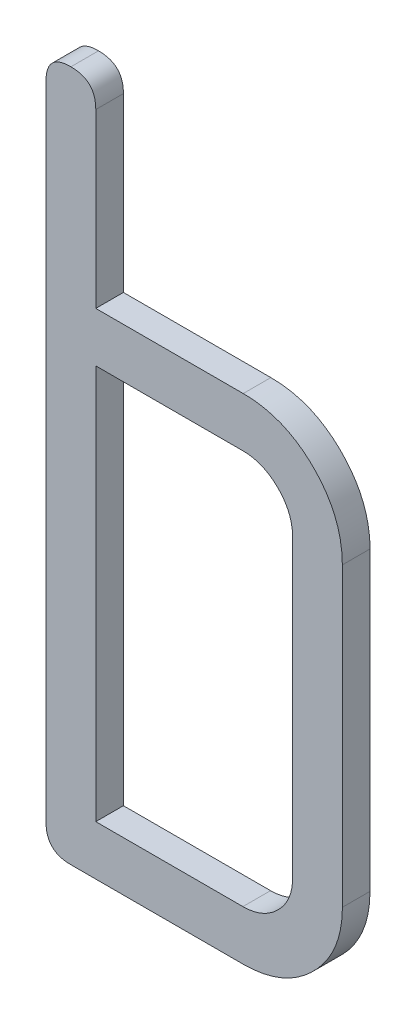
ISO-10303-21;
HEADER;
FILE_DESCRIPTION(('STEP AP214'),'2;1');
FILE_NAME('part.step','',(''),(''),'','','');
FILE_SCHEMA(('AUTOMOTIVE_DESIGN { 1 0 10303 214 1 1 1 1 }'));
ENDSEC;
DATA;
#1=APPLICATION_CONTEXT('core data for automotive mechanical design processes');
#2=APPLICATION_PROTOCOL_DEFINITION('international standard','automotive_design',2000,#1);
#3=PRODUCT_CONTEXT('',#1,'mechanical');
#4=PRODUCT('Part','Part','',(#3));
#5=PRODUCT_RELATED_PRODUCT_CATEGORY('part','',(#4));
#6=PRODUCT_DEFINITION_FORMATION('','',#4);
#7=PRODUCT_DEFINITION_CONTEXT('part definition',#1,'design');
#8=PRODUCT_DEFINITION('design','',#6,#7);
#9=PRODUCT_DEFINITION_SHAPE('','',#8);
#10=(LENGTH_UNIT() NAMED_UNIT(*) SI_UNIT(.MILLI.,.METRE.));
#11=(NAMED_UNIT(*) PLANE_ANGLE_UNIT() SI_UNIT($,.RADIAN.));
#12=(NAMED_UNIT(*) SI_UNIT($,.STERADIAN.) SOLID_ANGLE_UNIT());
#13=UNCERTAINTY_MEASURE_WITH_UNIT(LENGTH_MEASURE(1.E-05),#10,'distance_accuracy_value','');
#14=(GEOMETRIC_REPRESENTATION_CONTEXT(3) GLOBAL_UNCERTAINTY_ASSIGNED_CONTEXT((#13)) GLOBAL_UNIT_ASSIGNED_CONTEXT((#10,
#11,#12)) REPRESENTATION_CONTEXT('',''));
#15=CARTESIAN_POINT('',(0.,0.,0.));
#16=DIRECTION('',(0.,0.,1.));
#17=DIRECTION('',(1.,0.,0.));
#18=AXIS2_PLACEMENT_3D('',#15,#16,#17);
#19=CARTESIAN_POINT('',(0.,0.,1.7));
#20=DIRECTION('',(0.,0.,-1.));
#21=DIRECTION('',(-1.,0.,0.));
#22=AXIS2_PLACEMENT_3D('',#19,#20,#21);
#23=PLANE('',#22);
#24=CARTESIAN_POINT('',(-12.7169437525272,-19.5733047798276,1.7));
#25=CARTESIAN_POINT('',(-12.6269437525272,-19.5733047798276,1.7));
#26=CARTESIAN_POINT('',(-12.6269437525272,-19.6623047798276,1.7));
#27=B_SPLINE_CURVE_WITH_KNOTS('',2,(#24,#25,#26),.UNSPECIFIED.,.F.,.F.,(3,3),(0.,1.),.UNSPECIFIED.);
#28=CARTESIAN_POINT('',(-12.7169437525272,-19.5733047798276,1.7));
#29=VERTEX_POINT('',#28);
#30=CARTESIAN_POINT('',(-12.6269437525272,-19.6623047798276,1.7));
#31=VERTEX_POINT('',#30);
#32=EDGE_CURVE('E128',#29,#31,#27,.T.);
#33=ORIENTED_EDGE('',*,*,#32,.F.);
#34=CARTESIAN_POINT('',(-12.8069437525272,-19.6626172798276,1.7));
#35=CARTESIAN_POINT('',(-12.8069437525272,-19.5733047798276,1.7));
#36=CARTESIAN_POINT('',(-12.7169437525272,-19.5733047798276,1.7));
#37=B_SPLINE_CURVE_WITH_KNOTS('',2,(#34,#35,#36),.UNSPECIFIED.,.F.,.F.,(3,3),(0.,1.),.UNSPECIFIED.);
#38=CARTESIAN_POINT('',(-12.8069437525272,-19.6626172798276,1.7));
#39=VERTEX_POINT('',#38);
#40=EDGE_CURVE('E122',#39,#29,#37,.T.);
#41=ORIENTED_EDGE('',*,*,#40,.F.);
#42=DIRECTION('',(0.,1.,0.));
#43=VECTOR('',#42,1.);
#44=CARTESIAN_POINT('',(-12.8069437525272,-21.9839922798276,1.7));
#45=LINE('',#44,#43);
#46=CARTESIAN_POINT('',(-12.8069437525272,-21.9839922798276,1.7));
#47=VERTEX_POINT('',#46);
#48=EDGE_CURVE('E125',#47,#39,#45,.T.);
#49=ORIENTED_EDGE('',*,*,#48,.F.);
#50=CARTESIAN_POINT('',(-12.7176312525272,-22.0733047798276,1.7));
#51=CARTESIAN_POINT('',(-12.8069437525272,-22.0733047798276,1.7));
#52=CARTESIAN_POINT('',(-12.8069437525272,-21.9839922798276,1.7));
#53=B_SPLINE_CURVE_WITH_KNOTS('',2,(#50,#51,#52),.UNSPECIFIED.,.F.,.F.,(3,3),(0.,1.),.UNSPECIFIED.);
#54=CARTESIAN_POINT('',(-12.7176312525272,-22.0733047798276,1.7));
#55=VERTEX_POINT('',#54);
#56=EDGE_CURVE('E149',#47,#55,#53,.F.);
#57=ORIENTED_EDGE('',*,*,#56,.T.);
#58=DIRECTION('',(1.,0.,0.));
#59=VECTOR('',#58,1.);
#60=CARTESIAN_POINT('',(-12.0940687525272,-22.0733047798276,1.7));
#61=LINE('',#60,#59);
#62=CARTESIAN_POINT('',(-12.0940687525272,-22.0733047798276,1.7));
#63=VERTEX_POINT('',#62);
#64=EDGE_CURVE('E153',#63,#55,#61,.F.);
#65=ORIENTED_EDGE('',*,*,#64,.F.);
#66=CARTESIAN_POINT('',(-12.0940687525272,-22.0733047798276,1.7));
#67=CARTESIAN_POINT('',(-12.0835914524858,-22.0733048365618,1.7));
#68=CARTESIAN_POINT('',(-12.073114725821,-22.0729124755181,1.7));
#69=CARTESIAN_POINT('',(-12.0522178373082,-22.0712779212898,1.7));
#70=CARTESIAN_POINT('',(-12.041797745024,-22.0700348511606,1.7));
#71=CARTESIAN_POINT('',(-12.0109126991727,-22.0649616449102,1.7));
#72=CARTESIAN_POINT('',(-11.9906440888762,-22.0597895657084,1.7));
#73=CARTESIAN_POINT('',(-11.9517095701505,-22.0458335747576,1.7));
#74=CARTESIAN_POINT('',(-11.9330256046604,-22.0370997733915,1.7));
#75=CARTESIAN_POINT('',(-11.897503706816,-22.0163935749344,1.7));
#76=CARTESIAN_POINT('',(-11.8806696717177,-22.004414518186,1.7));
#77=CARTESIAN_POINT('',(-11.8574686643992,-21.9849217049437,1.7));
#78=CARTESIAN_POINT('',(-11.8502566677725,-21.9783769739309,1.7));
#79=CARTESIAN_POINT('',(-11.8363033916105,-21.9648034297382,1.7));
#80=CARTESIAN_POINT('',(-11.8295620996491,-21.9577746293467,1.7));
#81=CARTESIAN_POINT('',(-11.810171637487,-21.9359742575068,1.7));
#82=CARTESIAN_POINT('',(-11.7983270245127,-21.9204646790887,1.7));
#83=CARTESIAN_POINT('',(-11.7762557120634,-21.8857792862421,1.7));
#84=CARTESIAN_POINT('',(-11.7663643529929,-21.8663871826324,1.7));
#85=CARTESIAN_POINT('',(-11.7506169685404,-21.8260158209381,1.7));
#86=CARTESIAN_POINT('',(-11.7447620664972,-21.80503612283,1.7));
#87=CARTESIAN_POINT('',(-11.7388510091757,-21.7724925152227,1.7));
#88=CARTESIAN_POINT('',(-11.737362110455,-21.7611626763634,1.7));
#89=CARTESIAN_POINT('',(-11.7354097183411,-21.7384480020841,1.7));
#90=CARTESIAN_POINT('',(-11.734943152836,-21.7270634347479,1.7));
#91=CARTESIAN_POINT('',(-11.7349437525272,-21.7156797798276,1.7));
#92=B_SPLINE_CURVE_WITH_KNOTS('',3,(#66,#67,#68,#69,#70,#71,#72,#73,#74,#75,#76,#77,#78,#79,#80,
#81,#82,#83,#84,#85,#86,#87,#88,#89,#90,#91),.UNSPECIFIED.,.F.,.F.,(4,2,2,2,2,2,2,2,2,2,2,2,4),
(0.,0.0314203551476073,0.0628731485243589,0.125248921244741,0.186775837705111,0.248429984002855,
0.27762787915987,0.306825003242671,0.365107642748379,0.429993472428567,0.494897352435936,
0.529139249772235,0.563278108260437),.UNSPECIFIED.);
#93=CARTESIAN_POINT('',(-11.7349437525272,-21.7156797798276,1.7));
#94=VERTEX_POINT('',#93);
#95=EDGE_CURVE('E156',#63,#94,#92,.T.);
#96=ORIENTED_EDGE('',*,*,#95,.T.);
#97=DIRECTION('',(0.,1.,0.));
#98=VECTOR('',#97,1.);
#99=CARTESIAN_POINT('',(-11.7349437525272,-20.6429297798276,1.7));
#100=LINE('',#99,#98);
#101=CARTESIAN_POINT('',(-11.7349437525272,-20.6429297798276,1.7));
#102=VERTEX_POINT('',#101);
#103=EDGE_CURVE('E160',#102,#94,#100,.F.);
#104=ORIENTED_EDGE('',*,*,#103,.F.);
#105=CARTESIAN_POINT('',(-11.7349437525272,-20.6429297798276,1.7));
#106=CARTESIAN_POINT('',(-11.7349438065931,-20.6324532068069,1.7));
#107=CARTESIAN_POINT('',(-11.7353345334151,-20.6219771509781,1.7));
#108=CARTESIAN_POINT('',(-11.7369643163058,-20.6010807141977,1.7));
#109=CARTESIAN_POINT('',(-11.738204296593,-20.5906604063786,1.7));
#110=CARTESIAN_POINT('',(-11.7432702341652,-20.5597667812642,1.7));
#111=CARTESIAN_POINT('',(-11.7484401536519,-20.5394893369763,1.7));
#112=CARTESIAN_POINT('',(-11.7624097653175,-20.5005601205354,1.7));
#113=CARTESIAN_POINT('',(-11.7711563430554,-20.4818892059032,1.7));
#114=CARTESIAN_POINT('',(-11.7919127182465,-20.4464184302079,1.7));
#115=CARTESIAN_POINT('',(-11.8039286766642,-20.4296221869926,1.7));
#116=CARTESIAN_POINT('',(-11.8234369140789,-20.4065616622283,1.7));
#117=CARTESIAN_POINT('',(-11.8299486303523,-20.399436012233,1.7));
#118=CARTESIAN_POINT('',(-11.8434526627909,-20.3856555261654,1.7));
#119=CARTESIAN_POINT('',(-11.850444958151,-20.3790006697368,1.7));
#120=CARTESIAN_POINT('',(-11.8721294707985,-20.359870303108,1.7));
#121=CARTESIAN_POINT('',(-11.8875537523424,-20.3481998490659,1.7));
#122=CARTESIAN_POINT('',(-11.921963691998,-20.326497095518,1.7));
#123=CARTESIAN_POINT('',(-11.9411544696895,-20.3167862547127,1.7));
#124=CARTESIAN_POINT('',(-11.9810712697399,-20.3012721795261,1.7));
#125=CARTESIAN_POINT('',(-12.0017981994609,-20.2954712753851,1.7));
#126=CARTESIAN_POINT('',(-12.0345117796089,-20.2894220641814,1.7));
#127=CARTESIAN_POINT('',(-12.0462770650628,-20.2878513237265,1.7));
#128=CARTESIAN_POINT('',(-12.0698646056397,-20.2857940070144,1.7));
#129=CARTESIAN_POINT('',(-12.0816865465059,-20.2853038850315,1.7));
#130=CARTESIAN_POINT('',(-12.0935062525272,-20.2853047798276,1.7));
#131=B_SPLINE_CURVE_WITH_KNOTS('',3,(#105,#106,#107,#108,#109,#110,#111,#112,#113,#114,#115,
#116,#117,#118,#119,#120,#121,#122,#123,#124,#125,#126,#127,#128,#129,#130),.UNSPECIFIED.,.F.,
.F.,(4,2,2,2,2,2,2,2,2,2,2,2,4),(0.,0.0314182812754547,0.0628708086224728,0.125268135688372,
0.186770678789938,0.248389932432918,0.277329759725516,0.306268334950325,0.364032467799609,
0.428151331100405,0.492308374192021,0.527873693296446,0.563322140703057),.UNSPECIFIED.);
#132=CARTESIAN_POINT('',(-12.0935062525272,-20.2853047798276,1.7));
#133=VERTEX_POINT('',#132);
#134=EDGE_CURVE('E163',#102,#133,#131,.T.);
#135=ORIENTED_EDGE('',*,*,#134,.T.);
#136=DIRECTION('',(1.,0.,0.));
#137=VECTOR('',#136,1.);
#138=CARTESIAN_POINT('',(-12.6269437525272,-20.2853047798276,1.7));
#139=LINE('',#138,#137);
#140=CARTESIAN_POINT('',(-12.6269437525272,-20.2853047798276,1.7));
#141=VERTEX_POINT('',#140);
#142=EDGE_CURVE('E167',#141,#133,#139,.T.);
#143=ORIENTED_EDGE('',*,*,#142,.F.);
#144=DIRECTION('',(0.,1.,0.));
#145=VECTOR('',#144,1.);
#146=CARTESIAN_POINT('',(-12.6269437525272,-19.6623047798276,1.7));
#147=LINE('',#146,#145);
#148=EDGE_CURVE('E168',#31,#141,#147,.F.);
#149=ORIENTED_EDGE('',*,*,#148,.F.);
#150=EDGE_LOOP('',(#33,#41,#49,#57,#65,#96,#104,#135,#143,#149));
#151=FACE_BOUND('',#150,.T.);
#152=CARTESIAN_POINT('',(-11.9149437525272,-20.6438047798276,1.7));
#153=CARTESIAN_POINT('',(-11.914930147431,-20.6353604891261,1.7));
#154=CARTESIAN_POINT('',(-11.9154762004344,-20.6269015094391,1.7));
#155=CARTESIAN_POINT('',(-11.9177585864412,-20.6101706620539,1.7));
#156=CARTESIAN_POINT('',(-11.9194918047125,-20.601898363092,1.7));
#157=CARTESIAN_POINT('',(-11.9246736552446,-20.5841530247187,1.7));
#158=CARTESIAN_POINT('',(-11.9283882984683,-20.5747554216561,1.7));
#159=CARTESIAN_POINT('',(-11.9374705722218,-20.5567941650655,1.7));
#160=CARTESIAN_POINT('',(-11.9428397536227,-20.5482313039322,1.7));
#161=CARTESIAN_POINT('',(-11.9545088094744,-20.5326565741331,1.7));
#162=CARTESIAN_POINT('',(-11.9607235418156,-20.5255795559619,1.7));
#163=CARTESIAN_POINT('',(-11.9740178972537,-20.5122859772569,1.7));
#164=CARTESIAN_POINT('',(-11.9810981101327,-20.506070009709,1.7));
#165=CARTESIAN_POINT('',(-11.9976635468281,-20.4935829889184,1.7));
#166=CARTESIAN_POINT('',(-12.0073439176488,-20.4875635304049,1.7));
#167=CARTESIAN_POINT('',(-12.0277174481314,-20.4776127878627,1.7));
#168=CARTESIAN_POINT('',(-12.0384088579455,-20.4736779710752,1.7));
#169=CARTESIAN_POINT('',(-12.0567602216907,-20.4689613757244,1.7));
#170=CARTESIAN_POINT('',(-12.0642715951245,-20.4675697946959,1.7));
#171=CARTESIAN_POINT('',(-12.0794220785268,-20.4657374321208,1.7));
#172=CARTESIAN_POINT('',(-12.0870613572021,-20.4652980256877,1.7));
#173=CARTESIAN_POINT('',(-12.0946937525272,-20.4653047798276,1.7));
#174=B_SPLINE_CURVE_WITH_KNOTS('',3,(#152,#153,#154,#155,#156,#157,#158,#159,#160,#161,#162,
#163,#164,#165,#166,#167,#168,#169,#170,#171,#172,#173),.UNSPECIFIED.,.F.,.F.,(4,2,2,2,2,2,2,2,
2,2,4),(0.,0.0253350805156604,0.050603943433854,0.0807375528376654,0.110899494153716,
0.139064712853079,0.167249232879575,0.201230326274568,0.235153647566171,0.258012845749728,
0.280905034838524),.UNSPECIFIED.);
#175=CARTESIAN_POINT('',(-11.9149437525272,-20.6438047798276,1.7));
#176=VERTEX_POINT('',#175);
#177=CARTESIAN_POINT('',(-12.0946937525272,-20.4653047798276,1.7));
#178=VERTEX_POINT('',#177);
#179=EDGE_CURVE('E174',#176,#178,#174,.T.);
#180=ORIENTED_EDGE('',*,*,#179,.F.);
#181=DIRECTION('',(0.,1.,0.));
#182=VECTOR('',#181,1.);
#183=CARTESIAN_POINT('',(-11.9149437525272,-21.7148047798276,1.7));
#184=LINE('',#183,#182);
#185=CARTESIAN_POINT('',(-11.9149437525272,-21.7148047798276,1.7));
#186=VERTEX_POINT('',#185);
#187=EDGE_CURVE('E180',#176,#186,#184,.F.);
#188=ORIENTED_EDGE('',*,*,#187,.T.);
#189=CARTESIAN_POINT('',(-12.0946937525272,-21.8933047798276,1.7));
#190=CARTESIAN_POINT('',(-12.0862492512627,-21.8933181233194,1.7));
#191=CARTESIAN_POINT('',(-12.0777917968435,-21.892776187793,1.7));
#192=CARTESIAN_POINT('',(-12.0610635679903,-21.8905184445288,1.7));
#193=CARTESIAN_POINT('',(-12.0527923024834,-21.8888062254049,1.7));
#194=CARTESIAN_POINT('',(-12.034906085994,-21.8836594387585,1.7));
#195=CARTESIAN_POINT('',(-12.0253706950559,-21.8799401247856,1.7));
#196=CARTESIAN_POINT('',(-12.007123682082,-21.8708350658922,1.7));
#197=CARTESIAN_POINT('',(-11.9984133313438,-21.8654468021443,1.7));
#198=CARTESIAN_POINT('',(-11.9824651705536,-21.8536830163784,1.7));
#199=CARTESIAN_POINT('',(-11.9751716985514,-21.847381365031,1.7));
#200=CARTESIAN_POINT('',(-11.9614827286623,-21.8338707520946,1.7));
#201=CARTESIAN_POINT('',(-11.955086880106,-21.8266621469189,1.7));
#202=CARTESIAN_POINT('',(-11.9435957712379,-21.811444401755,1.7));
#203=CARTESIAN_POINT('',(-11.9384808969445,-21.8034503337011,1.7));
#204=CARTESIAN_POINT('',(-11.9296927241598,-21.7867102604086,1.7));
#205=CARTESIAN_POINT('',(-11.9260177792691,-21.7779651279657,1.7));
#206=CARTESIAN_POINT('',(-11.9203371131119,-21.7602614776157,1.7));
#207=CARTESIAN_POINT('',(-11.9182822167484,-21.7513184871417,1.7));
#208=CARTESIAN_POINT('',(-11.9155714960484,-21.7331787926239,1.7));
#209=CARTESIAN_POINT('',(-11.9149220037474,-21.7239811286246,1.7));
#210=CARTESIAN_POINT('',(-11.9149437525272,-21.7148047798276,1.7));
#211=B_SPLINE_CURVE_WITH_KNOTS('',3,(#189,#190,#191,#192,#193,#194,#195,#196,#197,#198,#199,
#200,#201,#202,#203,#204,#205,#206,#207,#208,#209,#210),.UNSPECIFIED.,.F.,.F.,(4,2,2,2,2,2,2,2,
2,2,4),(0.,0.0253332488046499,0.0505891609902319,0.0811127050569341,0.111682542474013,
0.140508172396911,0.169322509646491,0.197664171259586,0.225973332100662,0.253386006580878,
0.280921933664846),.UNSPECIFIED.);
#212=CARTESIAN_POINT('',(-12.0946937525272,-21.8933047798276,1.7));
#213=VERTEX_POINT('',#212);
#214=EDGE_CURVE('E23',#213,#186,#211,.T.);
#215=ORIENTED_EDGE('',*,*,#214,.F.);
#216=DIRECTION('',(1.,0.,0.));
#217=VECTOR('',#216,1.);
#218=CARTESIAN_POINT('',(-12.6269437525272,-21.8933047798276,1.7));
#219=LINE('',#218,#217);
#220=CARTESIAN_POINT('',(-12.6269437525272,-21.8933047798276,1.7));
#221=VERTEX_POINT('',#220);
#222=EDGE_CURVE('E187',#213,#221,#219,.F.);
#223=ORIENTED_EDGE('',*,*,#222,.T.);
#224=DIRECTION('',(0.,1.,0.));
#225=VECTOR('',#224,1.);
#226=CARTESIAN_POINT('',(-12.6269437525272,-20.4653047798276,1.7));
#227=LINE('',#226,#225);
#228=CARTESIAN_POINT('',(-12.6269437525272,-20.4653047798276,1.7));
#229=VERTEX_POINT('',#228);
#230=EDGE_CURVE('E200',#221,#229,#227,.T.);
#231=ORIENTED_EDGE('',*,*,#230,.T.);
#232=DIRECTION('',(1.,0.,0.));
#233=VECTOR('',#232,1.);
#234=CARTESIAN_POINT('',(-12.0946937525272,-20.4653047798276,1.7));
#235=LINE('',#234,#233);
#236=EDGE_CURVE('E497',#229,#178,#235,.T.);
#237=ORIENTED_EDGE('',*,*,#236,.T.);
#238=EDGE_LOOP('',(#180,#188,#215,#223,#231,#237));
#239=FACE_BOUND('',#238,.T.);
#240=ADVANCED_FACE('F17',(#151,#239),#23,.F.);
#241=CARTESIAN_POINT('',(-12.0946937525272,-20.4653047798276,1.7));
#242=DIRECTION('',(0.,1.,0.));
#243=DIRECTION('',(0.,0.,1.));
#244=AXIS2_PLACEMENT_3D('',#241,#242,#243);
#245=PLANE('',#244);
#246=DIRECTION('',(0.,0.,-1.));
#247=VECTOR('',#246,1.);
#248=CARTESIAN_POINT('',(-12.0946937525272,-20.4653047798276,1.65));
#249=LINE('',#248,#247);
#250=CARTESIAN_POINT('',(-12.0946937525272,-20.4653047798276,1.6));
#251=VERTEX_POINT('',#250);
#252=EDGE_CURVE('E171',#178,#251,#249,.T.);
#253=ORIENTED_EDGE('',*,*,#252,.F.);
#254=ORIENTED_EDGE('',*,*,#236,.F.);
#255=DIRECTION('',(0.,0.,1.));
#256=VECTOR('',#255,1.);
#257=CARTESIAN_POINT('',(-12.6269437525272,-20.4653047798276,1.7));
#258=LINE('',#257,#256);
#259=CARTESIAN_POINT('',(-12.6269437525272,-20.4653047798276,1.6));
#260=VERTEX_POINT('',#259);
#261=EDGE_CURVE('E197',#229,#260,#258,.F.);
#262=ORIENTED_EDGE('',*,*,#261,.T.);
#263=DIRECTION('',(-1.,0.,0.));
#264=VECTOR('',#263,1.);
#265=CARTESIAN_POINT('',(0.,-20.4653047798276,1.6));
#266=LINE('',#265,#264);
#267=EDGE_CURVE('E194',#251,#260,#266,.T.);
#268=ORIENTED_EDGE('',*,*,#267,.F.);
#269=EDGE_LOOP('',(#253,#254,#262,#268));
#270=FACE_BOUND('',#269,.T.);
#271=ADVANCED_FACE('F218',(#270),#245,.F.);
#272=CARTESIAN_POINT('',(-12.6269437525272,-20.4653047798276,1.7));
#273=DIRECTION('',(-1.,0.,0.));
#274=DIRECTION('',(0.,0.,1.));
#275=AXIS2_PLACEMENT_3D('',#272,#273,#274);
#276=PLANE('',#275);
#277=ORIENTED_EDGE('',*,*,#261,.F.);
#278=ORIENTED_EDGE('',*,*,#230,.F.);
#279=DIRECTION('',(0.,0.,-1.));
#280=VECTOR('',#279,1.);
#281=CARTESIAN_POINT('',(-12.6269437525272,-21.8933047798276,1.7));
#282=LINE('',#281,#280);
#283=CARTESIAN_POINT('',(-12.6269437525272,-21.8933047798276,1.6));
#284=VERTEX_POINT('',#283);
#285=EDGE_CURVE('E184',#221,#284,#282,.T.);
#286=ORIENTED_EDGE('',*,*,#285,.T.);
#287=DIRECTION('',(0.,1.,0.));
#288=VECTOR('',#287,1.);
#289=CARTESIAN_POINT('',(-12.6269437525272,0.,1.6));
#290=LINE('',#289,#288);
#291=EDGE_CURVE('E190',#260,#284,#290,.F.);
#292=ORIENTED_EDGE('',*,*,#291,.F.);
#293=EDGE_LOOP('',(#277,#278,#286,#292));
#294=FACE_BOUND('',#293,.T.);
#295=ADVANCED_FACE('F423',(#294),#276,.F.);
#296=CARTESIAN_POINT('',(-12.6269437525272,-21.8933047798276,1.7));
#297=DIRECTION('',(0.,-1.,0.));
#298=DIRECTION('',(0.,0.,-1.));
#299=AXIS2_PLACEMENT_3D('',#296,#297,#298);
#300=PLANE('',#299);
#301=ORIENTED_EDGE('',*,*,#285,.F.);
#302=ORIENTED_EDGE('',*,*,#222,.F.);
#303=DIRECTION('',(0.,0.,1.));
#304=VECTOR('',#303,1.);
#305=CARTESIAN_POINT('',(-12.0946937525272,-21.8933047798276,1.65));
#306=LINE('',#305,#304);
#307=CARTESIAN_POINT('',(-12.0946937525272,-21.8933047798276,1.6));
#308=VERTEX_POINT('',#307);
#309=EDGE_CURVE('E181',#308,#213,#306,.T.);
#310=ORIENTED_EDGE('',*,*,#309,.F.);
#311=DIRECTION('',(-1.,0.,0.));
#312=VECTOR('',#311,1.);
#313=CARTESIAN_POINT('',(0.,-21.8933047798276,1.6));
#314=LINE('',#313,#312);
#315=EDGE_CURVE('E193',#284,#308,#314,.F.);
#316=ORIENTED_EDGE('',*,*,#315,.F.);
#317=EDGE_LOOP('',(#301,#302,#310,#316));
#318=FACE_BOUND('',#317,.T.);
#319=ADVANCED_FACE('F416',(#318),#300,.F.);
#320=CARTESIAN_POINT('',(-11.9149437525272,-21.7148047798276,1.7));
#321=CARTESIAN_POINT('',(-11.9149437525272,-21.7879922798276,1.7));
#322=CARTESIAN_POINT('',(-12.0217562525272,-21.8933047798276,1.7));
#323=CARTESIAN_POINT('',(-12.0946937525272,-21.8933047798276,1.7));
#324=CARTESIAN_POINT('',(-11.9149437525272,-21.7148047798276,1.6));
#325=CARTESIAN_POINT('',(-11.9149437525272,-21.7879922798276,1.6));
#326=CARTESIAN_POINT('',(-12.0217562525272,-21.8933047798276,1.6));
#327=CARTESIAN_POINT('',(-12.0946937525272,-21.8933047798276,1.6));
#328=B_SPLINE_SURFACE_WITH_KNOTS('',1,2,((#320,#321,#322,#323),(#324,#325,#326,#327)),
.UNSPECIFIED.,.F.,.F.,.F.,(2,2),(3,1,3),(0.,1.),(0.,0.5,1.),.UNSPECIFIED.);
#329=DIRECTION('',(0.,0.,-1.));
#330=VECTOR('',#329,1.);
#331=CARTESIAN_POINT('',(-11.9149437525272,-21.7148047798276,1.7));
#332=LINE('',#331,#330);
#333=CARTESIAN_POINT('',(-11.9149437525272,-21.7148047798276,1.6));
#334=VERTEX_POINT('',#333);
#335=EDGE_CURVE('E178',#186,#334,#332,.T.);
#336=CARTESIAN_POINT('',(-12.0946937525272,-21.8933047798276,1.6));
#337=CARTESIAN_POINT('',(-12.0862492512627,-21.8933181233194,1.6));
#338=CARTESIAN_POINT('',(-12.0777917968435,-21.892776187793,1.6));
#339=CARTESIAN_POINT('',(-12.0610635679903,-21.8905184445288,1.6));
#340=CARTESIAN_POINT('',(-12.0527923024834,-21.8888062254049,1.6));
#341=CARTESIAN_POINT('',(-12.034906085994,-21.8836594387585,1.6));
#342=CARTESIAN_POINT('',(-12.0253706950559,-21.8799401247856,1.6));
#343=CARTESIAN_POINT('',(-12.007123682082,-21.8708350658922,1.6));
#344=CARTESIAN_POINT('',(-11.9984133313438,-21.8654468021443,1.6));
#345=CARTESIAN_POINT('',(-11.9824651705536,-21.8536830163784,1.6));
#346=CARTESIAN_POINT('',(-11.9751716985514,-21.847381365031,1.6));
#347=CARTESIAN_POINT('',(-11.9614827286623,-21.8338707520946,1.6));
#348=CARTESIAN_POINT('',(-11.955086880106,-21.8266621469189,1.6));
#349=CARTESIAN_POINT('',(-11.9435957712379,-21.811444401755,1.6));
#350=CARTESIAN_POINT('',(-11.9384808969445,-21.8034503337011,1.6));
#351=CARTESIAN_POINT('',(-11.9296927241598,-21.7867102604086,1.6));
#352=CARTESIAN_POINT('',(-11.9260177792691,-21.7779651279657,1.6));
#353=CARTESIAN_POINT('',(-11.9203371131119,-21.7602614776157,1.6));
#354=CARTESIAN_POINT('',(-11.9182822167484,-21.7513184871417,1.6));
#355=CARTESIAN_POINT('',(-11.9155714960484,-21.7331787926239,1.6));
#356=CARTESIAN_POINT('',(-11.9149220037474,-21.7239811286246,1.6));
#357=CARTESIAN_POINT('',(-11.9149437525272,-21.7148047798276,1.6));
#358=B_SPLINE_CURVE_WITH_KNOTS('',3,(#336,#337,#338,#339,#340,#341,#342,#343,#344,#345,#346,
#347,#348,#349,#350,#351,#352,#353,#354,#355,#356,#357),.UNSPECIFIED.,.F.,.F.,(4,2,2,2,2,2,2,2,
2,2,4),(0.,0.0253332488046496,0.0505891609902324,0.081112705056933,0.111682542474014,
0.140508172396913,0.169322509646496,0.197664171259602,0.225973332100676,0.253386006580885,
0.280921933664846),.UNSPECIFIED.);
#359=EDGE_CURVE('E281',#308,#334,#358,.T.);
#360=ORIENTED_EDGE('',*,*,#214,.T.);
#361=ORIENTED_EDGE('',*,*,#335,.T.);
#362=ORIENTED_EDGE('',*,*,#359,.F.);
#363=ORIENTED_EDGE('',*,*,#309,.T.);
#364=EDGE_LOOP('',(#360,#361,#362,#363));
#365=FACE_BOUND('',#364,.T.);
#366=ADVANCED_FACE('F220',(#365),#328,.T.);
#367=CARTESIAN_POINT('',(-11.9149437525272,-21.7148047798276,1.7));
#368=DIRECTION('',(1.,0.,0.));
#369=DIRECTION('',(0.,0.,-1.));
#370=AXIS2_PLACEMENT_3D('',#367,#368,#369);
#371=PLANE('',#370);
#372=ORIENTED_EDGE('',*,*,#335,.F.);
#373=ORIENTED_EDGE('',*,*,#187,.F.);
#374=DIRECTION('',(0.,0.,1.));
#375=VECTOR('',#374,1.);
#376=CARTESIAN_POINT('',(-11.9149437525272,-20.6438047798276,1.65));
#377=LINE('',#376,#375);
#378=CARTESIAN_POINT('',(-11.9149437525272,-20.6438047798276,1.6));
#379=VERTEX_POINT('',#378);
#380=EDGE_CURVE('E175',#379,#176,#377,.T.);
#381=ORIENTED_EDGE('',*,*,#380,.F.);
#382=DIRECTION('',(0.,1.,0.));
#383=VECTOR('',#382,1.);
#384=CARTESIAN_POINT('',(-11.9149437525272,0.,1.6));
#385=LINE('',#384,#383);
#386=EDGE_CURVE('E275',#334,#379,#385,.T.);
#387=ORIENTED_EDGE('',*,*,#386,.F.);
#388=EDGE_LOOP('',(#372,#373,#381,#387));
#389=FACE_BOUND('',#388,.T.);
#390=ADVANCED_FACE('F254',(#389),#371,.F.);
#391=CARTESIAN_POINT('',(-12.0946937525272,-20.4653047798276,1.7));
#392=CARTESIAN_POINT('',(-12.0217562525272,-20.4653047798276,1.7));
#393=CARTESIAN_POINT('',(-11.9149437525272,-20.5706172798276,1.7));
#394=CARTESIAN_POINT('',(-11.9149437525272,-20.6438047798276,1.7));
#395=CARTESIAN_POINT('',(-12.0946937525272,-20.4653047798276,1.6));
#396=CARTESIAN_POINT('',(-12.0217562525272,-20.4653047798276,1.6));
#397=CARTESIAN_POINT('',(-11.9149437525272,-20.5706172798276,1.6));
#398=CARTESIAN_POINT('',(-11.9149437525272,-20.6438047798276,1.6));
#399=B_SPLINE_SURFACE_WITH_KNOTS('',1,2,((#391,#392,#393,#394),(#395,#396,#397,#398)),
.UNSPECIFIED.,.F.,.F.,.F.,(2,2),(3,1,3),(0.,1.),(0.,0.5,1.),.UNSPECIFIED.);
#400=CARTESIAN_POINT('',(-11.9149437525272,-20.6438047798276,1.6));
#401=CARTESIAN_POINT('',(-11.914930147431,-20.6353604891261,1.6));
#402=CARTESIAN_POINT('',(-11.9154762004344,-20.6269015094391,1.6));
#403=CARTESIAN_POINT('',(-11.9177585864412,-20.6101706620539,1.6));
#404=CARTESIAN_POINT('',(-11.9194918047125,-20.601898363092,1.6));
#405=CARTESIAN_POINT('',(-11.9246736552446,-20.5841530247187,1.6));
#406=CARTESIAN_POINT('',(-11.9283882984683,-20.5747554216561,1.6));
#407=CARTESIAN_POINT('',(-11.9374705722218,-20.5567941650655,1.6));
#408=CARTESIAN_POINT('',(-11.9428397536227,-20.5482313039322,1.6));
#409=CARTESIAN_POINT('',(-11.9545088094744,-20.5326565741331,1.6));
#410=CARTESIAN_POINT('',(-11.9607235418156,-20.525579555962,1.6));
#411=CARTESIAN_POINT('',(-11.9740178972537,-20.5122859772569,1.6));
#412=CARTESIAN_POINT('',(-11.9810981101326,-20.506070009709,1.6));
#413=CARTESIAN_POINT('',(-11.9976635468281,-20.4935829889184,1.6));
#414=CARTESIAN_POINT('',(-12.0073439176488,-20.4875635304049,1.6));
#415=CARTESIAN_POINT('',(-12.0277174481314,-20.4776127878627,1.6));
#416=CARTESIAN_POINT('',(-12.0384088579455,-20.4736779710752,1.6));
#417=CARTESIAN_POINT('',(-12.0567602216907,-20.4689613757244,1.6));
#418=CARTESIAN_POINT('',(-12.0642715951245,-20.4675697946959,1.6));
#419=CARTESIAN_POINT('',(-12.0794220785268,-20.4657374321208,1.6));
#420=CARTESIAN_POINT('',(-12.0870613572021,-20.4652980256877,1.6));
#421=CARTESIAN_POINT('',(-12.0946937525272,-20.4653047798276,1.6));
#422=B_SPLINE_CURVE_WITH_KNOTS('',3,(#400,#401,#402,#403,#404,#405,#406,#407,#408,#409,#410,
#411,#412,#413,#414,#415,#416,#417,#418,#419,#420,#421),.UNSPECIFIED.,.F.,.F.,(4,2,2,2,2,2,2,2,
2,2,4),(0.,0.0253350805156602,0.0506039434338545,0.0807375528376653,0.110899494153708,
0.139064712853072,0.16724923287957,0.201230326274575,0.235153647566188,0.258012845749736,
0.280905034838525),.UNSPECIFIED.);
#423=EDGE_CURVE('E267',#379,#251,#422,.T.);
#424=ORIENTED_EDGE('',*,*,#179,.T.);
#425=ORIENTED_EDGE('',*,*,#252,.T.);
#426=ORIENTED_EDGE('',*,*,#423,.F.);
#427=ORIENTED_EDGE('',*,*,#380,.T.);
#428=EDGE_LOOP('',(#424,#425,#426,#427));
#429=FACE_BOUND('',#428,.T.);
#430=ADVANCED_FACE('F248',(#429),#399,.T.);
#431=CARTESIAN_POINT('',(-12.6269437525272,-19.6623047798276,1.7));
#432=DIRECTION('',(1.,0.,0.));
#433=DIRECTION('',(0.,0.,-1.));
#434=AXIS2_PLACEMENT_3D('',#431,#432,#433);
#435=PLANE('',#434);
#436=ORIENTED_EDGE('',*,*,#148,.T.);
#437=DIRECTION('',(0.,0.,1.));
#438=VECTOR('',#437,1.);
#439=CARTESIAN_POINT('',(-12.6269437525272,-20.2853047798276,1.7));
#440=LINE('',#439,#438);
#441=CARTESIAN_POINT('',(-12.6269437525272,-20.2853047798276,1.6));
#442=VERTEX_POINT('',#441);
#443=EDGE_CURVE('E164',#442,#141,#440,.T.);
#444=ORIENTED_EDGE('',*,*,#443,.F.);
#445=DIRECTION('',(0.,1.,0.));
#446=VECTOR('',#445,1.);
#447=CARTESIAN_POINT('',(-12.6269437525272,0.,1.6));
#448=LINE('',#447,#446);
#449=CARTESIAN_POINT('',(-12.6269437525272,-19.6623047798276,1.6));
#450=VERTEX_POINT('',#449);
#451=EDGE_CURVE('E274',#450,#442,#448,.F.);
#452=ORIENTED_EDGE('',*,*,#451,.F.);
#453=DIRECTION('',(0.,0.,1.));
#454=VECTOR('',#453,1.);
#455=CARTESIAN_POINT('',(-12.6269437525272,-19.6623047798276,1.65));
#456=LINE('',#455,#454);
#457=EDGE_CURVE('E140',#450,#31,#456,.T.);
#458=ORIENTED_EDGE('',*,*,#457,.T.);
#459=EDGE_LOOP('',(#436,#444,#452,#458));
#460=FACE_BOUND('',#459,.T.);
#461=ADVANCED_FACE('F253',(#460),#435,.T.);
#462=CARTESIAN_POINT('',(-12.6269437525272,-20.2853047798276,1.7));
#463=DIRECTION('',(0.,1.,0.));
#464=DIRECTION('',(0.,0.,1.));
#465=AXIS2_PLACEMENT_3D('',#462,#463,#464);
#466=PLANE('',#465);
#467=ORIENTED_EDGE('',*,*,#142,.T.);
#468=DIRECTION('',(0.,0.,-1.));
#469=VECTOR('',#468,1.);
#470=CARTESIAN_POINT('',(-12.0935062525272,-20.2853047798276,1.65));
#471=LINE('',#470,#469);
#472=CARTESIAN_POINT('',(-12.0935062525272,-20.2853047798276,1.6));
#473=VERTEX_POINT('',#472);
#474=EDGE_CURVE('E161',#133,#473,#471,.T.);
#475=ORIENTED_EDGE('',*,*,#474,.T.);
#476=DIRECTION('',(-1.,0.,0.));
#477=VECTOR('',#476,1.);
#478=CARTESIAN_POINT('',(0.,-20.2853047798276,1.6));
#479=LINE('',#478,#477);
#480=EDGE_CURVE('E542',#442,#473,#479,.F.);
#481=ORIENTED_EDGE('',*,*,#480,.F.);
#482=ORIENTED_EDGE('',*,*,#443,.T.);
#483=EDGE_LOOP('',(#467,#475,#481,#482));
#484=FACE_BOUND('',#483,.T.);
#485=ADVANCED_FACE('F384',(#484),#466,.T.);
#486=CARTESIAN_POINT('',(-12.0935062525272,-20.2853047798276,1.7));
#487=CARTESIAN_POINT('',(-11.9436937525272,-20.2853047798276,1.7));
#488=CARTESIAN_POINT('',(-11.7349437525272,-20.4944922798276,1.7));
#489=CARTESIAN_POINT('',(-11.7349437525272,-20.6429297798276,1.7));
#490=CARTESIAN_POINT('',(-12.0935062525272,-20.2853047798276,1.6));
#491=CARTESIAN_POINT('',(-11.9436937525272,-20.2853047798276,1.6));
#492=CARTESIAN_POINT('',(-11.7349437525272,-20.4944922798276,1.6));
#493=CARTESIAN_POINT('',(-11.7349437525272,-20.6429297798276,1.6));
#494=B_SPLINE_SURFACE_WITH_KNOTS('',1,2,((#486,#487,#488,#489),(#490,#491,#492,#493)),
.UNSPECIFIED.,.F.,.F.,.F.,(2,2),(3,1,3),(0.,1.),(0.,0.5,1.),.UNSPECIFIED.);
#495=DIRECTION('',(0.,0.,-1.));
#496=VECTOR('',#495,1.);
#497=CARTESIAN_POINT('',(-11.7349437525272,-20.6429297798276,1.7));
#498=LINE('',#497,#496);
#499=CARTESIAN_POINT('',(-11.7349437525272,-20.6429297798276,1.6));
#500=VERTEX_POINT('',#499);
#501=EDGE_CURVE('E157',#500,#102,#498,.F.);
#502=CARTESIAN_POINT('',(-12.0935062525272,-20.2853047798276,1.6));
#503=CARTESIAN_POINT('',(-12.0829030087647,-20.2853049952884,1.6));
#504=CARTESIAN_POINT('',(-12.0723002149202,-20.285698592128,1.6));
#505=CARTESIAN_POINT('',(-12.051149762991,-20.2873434126147,1.6));
#506=CARTESIAN_POINT('',(-12.0406021849269,-20.2885956498183,1.6));
#507=CARTESIAN_POINT('',(-12.0093243426374,-20.293718937261,1.6));
#508=CARTESIAN_POINT('',(-11.9887920543573,-20.2989544857946,1.6));
#509=CARTESIAN_POINT('',(-11.9494333777869,-20.3131211366371,1.6));
#510=CARTESIAN_POINT('',(-11.9305843584718,-20.3219895596789,1.6));
#511=CARTESIAN_POINT('',(-11.8948151771051,-20.3430590135143,1.6));
#512=CARTESIAN_POINT('',(-11.8778982416789,-20.3552655068452,1.6));
#513=CARTESIAN_POINT('',(-11.8548053241233,-20.3750162140771,1.6));
#514=CARTESIAN_POINT('',(-11.8477330065482,-20.3815517953204,1.6));
#515=CARTESIAN_POINT('',(-11.8340605490659,-20.3950997009705,1.6));
#516=CARTESIAN_POINT('',(-11.8274603948887,-20.4021120109567,1.6));
#517=CARTESIAN_POINT('',(-11.8084849053464,-20.4238461568291,1.6));
#518=CARTESIAN_POINT('',(-11.7969088018005,-20.4392870846583,1.6));
#519=CARTESIAN_POINT('',(-11.7753382073332,-20.4737919219049,1.6));
#520=CARTESIAN_POINT('',(-11.7656793002554,-20.4930682778097,1.6));
#521=CARTESIAN_POINT('',(-11.7503035963986,-20.5331445141838,1.6));
#522=CARTESIAN_POINT('',(-11.7445879207661,-20.5539448260889,1.6));
#523=CARTESIAN_POINT('',(-11.7387914696276,-20.5862696002086,1.6));
#524=CARTESIAN_POINT('',(-11.7373251848774,-20.5975704165753,1.6));
#525=CARTESIAN_POINT('',(-11.7354025550513,-20.6202245784204,1.6));
#526=CARTESIAN_POINT('',(-11.7349431749031,-20.6315776623826,1.6));
#527=CARTESIAN_POINT('',(-11.7349437525272,-20.6429297798276,1.6));
#528=B_SPLINE_CURVE_WITH_KNOTS('',3,(#502,#503,#504,#505,#506,#507,#508,#509,#510,#511,#512,
#513,#514,#515,#516,#517,#518,#519,#520,#521,#522,#523,#524,#525,#526,#527),.UNSPECIFIED.,.F.,
.F.,(4,2,2,2,2,2,2,2,2,2,2,2,4),(0.,0.0317982638975795,0.0636341278656524,0.126811477397533,
0.188941873036309,0.251174555848936,0.280045070800664,0.308914712841408,0.366553602328234,
0.43082916951514,0.495123004119725,0.529270809489162,0.563315542124774),.UNSPECIFIED.);
#529=EDGE_CURVE('E276',#473,#500,#528,.T.);
#530=ORIENTED_EDGE('',*,*,#474,.F.);
#531=ORIENTED_EDGE('',*,*,#134,.F.);
#532=ORIENTED_EDGE('',*,*,#501,.F.);
#533=ORIENTED_EDGE('',*,*,#529,.F.);
#534=EDGE_LOOP('',(#530,#531,#532,#533));
#535=FACE_BOUND('',#534,.T.);
#536=ADVANCED_FACE('F256',(#535),#494,.F.);
#537=CARTESIAN_POINT('',(-11.7349437525272,-20.6429297798276,1.7));
#538=DIRECTION('',(1.,0.,0.));
#539=DIRECTION('',(0.,0.,-1.));
#540=AXIS2_PLACEMENT_3D('',#537,#538,#539);
#541=PLANE('',#540);
#542=ORIENTED_EDGE('',*,*,#103,.T.);
#543=DIRECTION('',(0.,0.,-1.));
#544=VECTOR('',#543,1.);
#545=CARTESIAN_POINT('',(-11.7349437525272,-21.7156797798276,1.65));
#546=LINE('',#545,#544);
#547=CARTESIAN_POINT('',(-11.7349437525272,-21.7156797798276,1.6));
#548=VERTEX_POINT('',#547);
#549=EDGE_CURVE('E154',#94,#548,#546,.T.);
#550=ORIENTED_EDGE('',*,*,#549,.T.);
#551=DIRECTION('',(0.,1.,0.));
#552=VECTOR('',#551,1.);
#553=CARTESIAN_POINT('',(-11.7349437525272,0.,1.6));
#554=LINE('',#553,#552);
#555=EDGE_CURVE('E311',#500,#548,#554,.F.);
#556=ORIENTED_EDGE('',*,*,#555,.F.);
#557=ORIENTED_EDGE('',*,*,#501,.T.);
#558=EDGE_LOOP('',(#542,#550,#556,#557));
#559=FACE_BOUND('',#558,.T.);
#560=ADVANCED_FACE('F321',(#559),#541,.T.);
#561=CARTESIAN_POINT('',(-11.7349437525272,-21.7156797798276,1.7));
#562=CARTESIAN_POINT('',(-11.7349437525272,-21.8641172798276,1.7));
#563=CARTESIAN_POINT('',(-11.9457562525272,-22.0733047798276,1.7));
#564=CARTESIAN_POINT('',(-12.0940687525272,-22.0733047798276,1.7));
#565=CARTESIAN_POINT('',(-11.7349437525272,-21.7156797798276,1.6));
#566=CARTESIAN_POINT('',(-11.7349437525272,-21.8641172798276,1.6));
#567=CARTESIAN_POINT('',(-11.9457562525272,-22.0733047798276,1.6));
#568=CARTESIAN_POINT('',(-12.0940687525272,-22.0733047798276,1.6));
#569=B_SPLINE_SURFACE_WITH_KNOTS('',1,2,((#561,#562,#563,#564),(#565,#566,#567,#568)),
.UNSPECIFIED.,.F.,.F.,.F.,(2,2),(3,1,3),(0.,1.),(0.,0.5,1.),.UNSPECIFIED.);
#570=DIRECTION('',(0.,0.,-1.));
#571=VECTOR('',#570,1.);
#572=CARTESIAN_POINT('',(-12.0940687525272,-22.0733047798276,1.7));
#573=LINE('',#572,#571);
#574=CARTESIAN_POINT('',(-12.0940687525272,-22.0733047798276,1.6));
#575=VERTEX_POINT('',#574);
#576=EDGE_CURVE('E150',#575,#63,#573,.F.);
#577=CARTESIAN_POINT('',(-11.7349437525272,-21.7156797798276,1.6));
#578=CARTESIAN_POINT('',(-11.7349437516992,-21.7260616253424,1.6));
#579=CARTESIAN_POINT('',(-11.7353312793411,-21.7364429253574,1.6));
#580=CARTESIAN_POINT('',(-11.736946824823,-21.7571501801166,1.6));
#581=CARTESIAN_POINT('',(-11.7381757439229,-21.7674760635359,1.6));
#582=CARTESIAN_POINT('',(-11.7431943581313,-21.7980880691321,1.6));
#583=CARTESIAN_POINT('',(-11.7483139033055,-21.8181802520944,1.6));
#584=CARTESIAN_POINT('',(-11.7621468679901,-21.8567836201269,1.6));
#585=CARTESIAN_POINT('',(-11.7708123692194,-21.8753120569216,1.6));
#586=CARTESIAN_POINT('',(-11.7913688853598,-21.9105213214492,1.6));
#587=CARTESIAN_POINT('',(-11.8032656525893,-21.927198778752,1.6));
#588=CARTESIAN_POINT('',(-11.8225972357792,-21.95012481496,1.6));
#589=CARTESIAN_POINT('',(-11.8290622334089,-21.9572223572591,1.6));
#590=CARTESIAN_POINT('',(-11.8424662204754,-21.9709552291735,1.6));
#591=CARTESIAN_POINT('',(-11.849405215711,-21.9775905531321,1.6));
#592=CARTESIAN_POINT('',(-11.8709051553636,-21.9967070100753,1.6));
#593=CARTESIAN_POINT('',(-11.8861680413773,-22.0084211780248,1.6));
#594=CARTESIAN_POINT('',(-11.9206568860612,-22.0306099554839,1.6));
#595=CARTESIAN_POINT('',(-11.9401391772895,-22.0406921630369,1.6));
#596=CARTESIAN_POINT('',(-11.9807183370137,-22.0568150494265,1.6));
#597=CARTESIAN_POINT('',(-12.0018152776723,-22.0628555475116,1.6));
#598=CARTESIAN_POINT('',(-12.0349381417666,-22.0690925372438,1.6));
#599=CARTESIAN_POINT('',(-12.0467235557714,-22.0706975255208,1.6));
#600=CARTESIAN_POINT('',(-12.0703630157065,-22.0728027977809,1.6));
#601=CARTESIAN_POINT('',(-12.0822168010303,-22.073305964156,1.6));
#602=CARTESIAN_POINT('',(-12.0940687525272,-22.0733047798276,1.6));
#603=B_SPLINE_CURVE_WITH_KNOTS('',3,(#577,#578,#579,#580,#581,#582,#583,#584,#585,#586,#587,
#588,#589,#590,#591,#592,#593,#594,#595,#596,#597,#598,#599,#600,#601,#602),.UNSPECIFIED.,.F.,
.F.,(4,2,2,2,2,2,2,2,2,2,2,2,4),(0.,0.0311341587651832,0.062301719295444,0.124128276281809,
0.185145569382478,0.246272205954323,0.275055425106999,0.303838996451214,0.361318482306926,
0.4267077309878,0.492099903785454,0.527737164991467,0.56328108635011),.UNSPECIFIED.);
#604=EDGE_CURVE('E304',#548,#575,#603,.T.);
#605=ORIENTED_EDGE('',*,*,#549,.F.);
#606=ORIENTED_EDGE('',*,*,#95,.F.);
#607=ORIENTED_EDGE('',*,*,#576,.F.);
#608=ORIENTED_EDGE('',*,*,#604,.F.);
#609=EDGE_LOOP('',(#605,#606,#607,#608));
#610=FACE_BOUND('',#609,.T.);
#611=ADVANCED_FACE('F314',(#610),#569,.F.);
#612=CARTESIAN_POINT('',(-12.0940687525272,-22.0733047798276,1.7));
#613=DIRECTION('',(0.,-1.,0.));
#614=DIRECTION('',(0.,0.,-1.));
#615=AXIS2_PLACEMENT_3D('',#612,#613,#614);
#616=PLANE('',#615);
#617=ORIENTED_EDGE('',*,*,#64,.T.);
#618=DIRECTION('',(0.,0.,-1.));
#619=VECTOR('',#618,1.);
#620=CARTESIAN_POINT('',(-12.7176312525272,-22.0733047798276,1.65));
#621=LINE('',#620,#619);
#622=CARTESIAN_POINT('',(-12.7176312525272,-22.0733047798276,1.6));
#623=VERTEX_POINT('',#622);
#624=EDGE_CURVE('E147',#55,#623,#621,.T.);
#625=ORIENTED_EDGE('',*,*,#624,.T.);
#626=DIRECTION('',(-1.,0.,0.));
#627=VECTOR('',#626,1.);
#628=CARTESIAN_POINT('',(0.,-22.0733047798276,1.6));
#629=LINE('',#628,#627);
#630=EDGE_CURVE('E310',#575,#623,#629,.T.);
#631=ORIENTED_EDGE('',*,*,#630,.F.);
#632=ORIENTED_EDGE('',*,*,#576,.T.);
#633=EDGE_LOOP('',(#617,#625,#631,#632));
#634=FACE_BOUND('',#633,.T.);
#635=ADVANCED_FACE('F320',(#634),#616,.T.);
#636=CARTESIAN_POINT('',(-12.7176312525272,-22.0733047798276,1.7));
#637=CARTESIAN_POINT('',(-12.8069437525272,-22.0733047798276,1.7));
#638=CARTESIAN_POINT('',(-12.8069437525272,-21.9839922798276,1.7));
#639=CARTESIAN_POINT('',(-12.7176312525272,-22.0733047798276,1.6));
#640=CARTESIAN_POINT('',(-12.8069437525272,-22.0733047798276,1.6));
#641=CARTESIAN_POINT('',(-12.8069437525272,-21.9839922798276,1.6));
#642=B_SPLINE_SURFACE_WITH_KNOTS('',1,2,((#636,#637,#638),(#639,#640,#641)),.UNSPECIFIED.,.F.,
.F.,.F.,(2,2),(3,3),(0.,1.),(0.,1.),.UNSPECIFIED.);
#643=DIRECTION('',(0.,0.,1.));
#644=VECTOR('',#643,1.);
#645=CARTESIAN_POINT('',(-12.8069437525272,-21.9839922798276,1.7));
#646=LINE('',#645,#644);
#647=CARTESIAN_POINT('',(-12.8069437525272,-21.9839922798276,1.6));
#648=VERTEX_POINT('',#647);
#649=EDGE_CURVE('E135',#648,#47,#646,.T.);
#650=CARTESIAN_POINT('',(-12.7176312525272,-22.0733047798276,1.6));
#651=CARTESIAN_POINT('',(-12.8069437525272,-22.0733047798276,1.6));
#652=CARTESIAN_POINT('',(-12.8069437525272,-21.9839922798276,1.6));
#653=B_SPLINE_CURVE_WITH_KNOTS('',2,(#650,#651,#652),.UNSPECIFIED.,.F.,.F.,(3,3),(0.,1.),.UNSPECIFIED.);
#654=EDGE_CURVE('E299',#623,#648,#653,.T.);
#655=ORIENTED_EDGE('',*,*,#624,.F.);
#656=ORIENTED_EDGE('',*,*,#56,.F.);
#657=ORIENTED_EDGE('',*,*,#649,.F.);
#658=ORIENTED_EDGE('',*,*,#654,.F.);
#659=EDGE_LOOP('',(#655,#656,#657,#658));
#660=FACE_BOUND('',#659,.T.);
#661=ADVANCED_FACE('F323',(#660),#642,.F.);
#662=CARTESIAN_POINT('',(-12.8069437525272,-21.9839922798276,1.7));
#663=DIRECTION('',(-1.,0.,0.));
#664=DIRECTION('',(0.,0.,1.));
#665=AXIS2_PLACEMENT_3D('',#662,#663,#664);
#666=PLANE('',#665);
#667=ORIENTED_EDGE('',*,*,#48,.T.);
#668=DIRECTION('',(0.,0.,-1.));
#669=VECTOR('',#668,1.);
#670=CARTESIAN_POINT('',(-12.8069437525272,-19.6626172798276,1.65));
#671=LINE('',#670,#669);
#672=CARTESIAN_POINT('',(-12.8069437525272,-19.6626172798276,1.6));
#673=VERTEX_POINT('',#672);
#674=EDGE_CURVE('E134',#39,#673,#671,.T.);
#675=ORIENTED_EDGE('',*,*,#674,.T.);
#676=DIRECTION('',(0.,1.,0.));
#677=VECTOR('',#676,1.);
#678=CARTESIAN_POINT('',(-12.8069437525272,0.,1.6));
#679=LINE('',#678,#677);
#680=EDGE_CURVE('E563',#648,#673,#679,.T.);
#681=ORIENTED_EDGE('',*,*,#680,.F.);
#682=ORIENTED_EDGE('',*,*,#649,.T.);
#683=EDGE_LOOP('',(#667,#675,#681,#682));
#684=FACE_BOUND('',#683,.T.);
#685=ADVANCED_FACE('F132',(#684),#666,.T.);
#686=CARTESIAN_POINT('',(-12.8069437525272,-19.6626172798276,1.7));
#687=CARTESIAN_POINT('',(-12.8069437525272,-19.5733047798276,1.7));
#688=CARTESIAN_POINT('',(-12.7169437525272,-19.5733047798276,1.7));
#689=CARTESIAN_POINT('',(-12.8069437525272,-19.6626172798276,1.6));
#690=CARTESIAN_POINT('',(-12.8069437525272,-19.5733047798276,1.6));
#691=CARTESIAN_POINT('',(-12.7169437525272,-19.5733047798276,1.6));
#692=B_SPLINE_SURFACE_WITH_KNOTS('',1,2,((#686,#687,#688),(#689,#690,#691)),.UNSPECIFIED.,.F.,
.F.,.F.,(2,2),(3,3),(0.,1.),(0.,1.),.UNSPECIFIED.);
#693=DIRECTION('',(0.,0.,-1.));
#694=VECTOR('',#693,1.);
#695=CARTESIAN_POINT('',(-12.7169437525272,-19.5733047798276,1.65));
#696=LINE('',#695,#694);
#697=CARTESIAN_POINT('',(-12.7169437525272,-19.5733047798276,1.6));
#698=VERTEX_POINT('',#697);
#699=EDGE_CURVE('E43',#29,#698,#696,.T.);
#700=CARTESIAN_POINT('',(-12.8069437525272,-19.6626172798276,1.6));
#701=CARTESIAN_POINT('',(-12.8069437525272,-19.5733047798276,1.6));
#702=CARTESIAN_POINT('',(-12.7169437525272,-19.5733047798276,1.6));
#703=B_SPLINE_CURVE_WITH_KNOTS('',2,(#700,#701,#702),.UNSPECIFIED.,.F.,.F.,(3,3),(0.,1.),.UNSPECIFIED.);
#704=EDGE_CURVE('E34',#673,#698,#703,.T.);
#705=ORIENTED_EDGE('',*,*,#674,.F.);
#706=ORIENTED_EDGE('',*,*,#40,.T.);
#707=ORIENTED_EDGE('',*,*,#699,.T.);
#708=ORIENTED_EDGE('',*,*,#704,.F.);
#709=EDGE_LOOP('',(#705,#706,#707,#708));
#710=FACE_BOUND('',#709,.T.);
#711=ADVANCED_FACE('F137',(#710),#692,.F.);
#712=CARTESIAN_POINT('',(-12.7169437525272,-19.5733047798276,1.7));
#713=CARTESIAN_POINT('',(-12.6269437525272,-19.5733047798276,1.7));
#714=CARTESIAN_POINT('',(-12.6269437525272,-19.6623047798276,1.7));
#715=CARTESIAN_POINT('',(-12.7169437525272,-19.5733047798276,1.6));
#716=CARTESIAN_POINT('',(-12.6269437525272,-19.5733047798276,1.6));
#717=CARTESIAN_POINT('',(-12.6269437525272,-19.6623047798276,1.6));
#718=B_SPLINE_SURFACE_WITH_KNOTS('',1,2,((#712,#713,#714),(#715,#716,#717)),.UNSPECIFIED.,.F.,
.F.,.F.,(2,2),(3,3),(0.,1.),(0.,1.),.UNSPECIFIED.);
#719=CARTESIAN_POINT('',(-12.7169437525272,-19.5733047798276,1.6));
#720=CARTESIAN_POINT('',(-12.6269437525272,-19.5733047798276,1.6));
#721=CARTESIAN_POINT('',(-12.6269437525272,-19.6623047798276,1.6));
#722=B_SPLINE_CURVE_WITH_KNOTS('',2,(#719,#720,#721),.UNSPECIFIED.,.F.,.F.,(3,3),(0.,1.),.UNSPECIFIED.);
#723=EDGE_CURVE('E11',#698,#450,#722,.T.);
#724=ORIENTED_EDGE('',*,*,#699,.F.);
#725=ORIENTED_EDGE('',*,*,#32,.T.);
#726=ORIENTED_EDGE('',*,*,#457,.F.);
#727=ORIENTED_EDGE('',*,*,#723,.F.);
#728=EDGE_LOOP('',(#724,#725,#726,#727));
#729=FACE_BOUND('',#728,.T.);
#730=ADVANCED_FACE('F19',(#729),#718,.F.);
#731=CARTESIAN_POINT('',(0.,0.,1.6));
#732=DIRECTION('',(0.,0.,-1.));
#733=DIRECTION('',(-1.,0.,0.));
#734=AXIS2_PLACEMENT_3D('',#731,#732,#733);
#735=PLANE('',#734);
#736=ORIENTED_EDGE('',*,*,#704,.T.);
#737=ORIENTED_EDGE('',*,*,#723,.T.);
#738=ORIENTED_EDGE('',*,*,#451,.T.);
#739=ORIENTED_EDGE('',*,*,#480,.T.);
#740=ORIENTED_EDGE('',*,*,#529,.T.);
#741=ORIENTED_EDGE('',*,*,#555,.T.);
#742=ORIENTED_EDGE('',*,*,#604,.T.);
#743=ORIENTED_EDGE('',*,*,#630,.T.);
#744=ORIENTED_EDGE('',*,*,#654,.T.);
#745=ORIENTED_EDGE('',*,*,#680,.T.);
#746=EDGE_LOOP('',(#736,#737,#738,#739,#740,#741,#742,#743,#744,#745));
#747=FACE_BOUND('',#746,.T.);
#748=ORIENTED_EDGE('',*,*,#386,.T.);
#749=ORIENTED_EDGE('',*,*,#423,.T.);
#750=ORIENTED_EDGE('',*,*,#267,.T.);
#751=ORIENTED_EDGE('',*,*,#291,.T.);
#752=ORIENTED_EDGE('',*,*,#315,.T.);
#753=ORIENTED_EDGE('',*,*,#359,.T.);
#754=EDGE_LOOP('',(#748,#749,#750,#751,#752,#753));
#755=FACE_BOUND('',#754,.T.);
#756=ADVANCED_FACE('F285',(#747,#755),#735,.T.);
#757=CLOSED_SHELL('',(#240,#271,#295,#319,#366,#390,#430,#461,#485,#536,#560,#611,#635,#661,
#685,#711,#730,#756));
#758=MANIFOLD_SOLID_BREP('B1',#757);
#759=ADVANCED_BREP_SHAPE_REPRESENTATION('',(#18,#758),#14);
#760=SHAPE_DEFINITION_REPRESENTATION(#9,#759);
ENDSEC;
END-ISO-10303-21;
